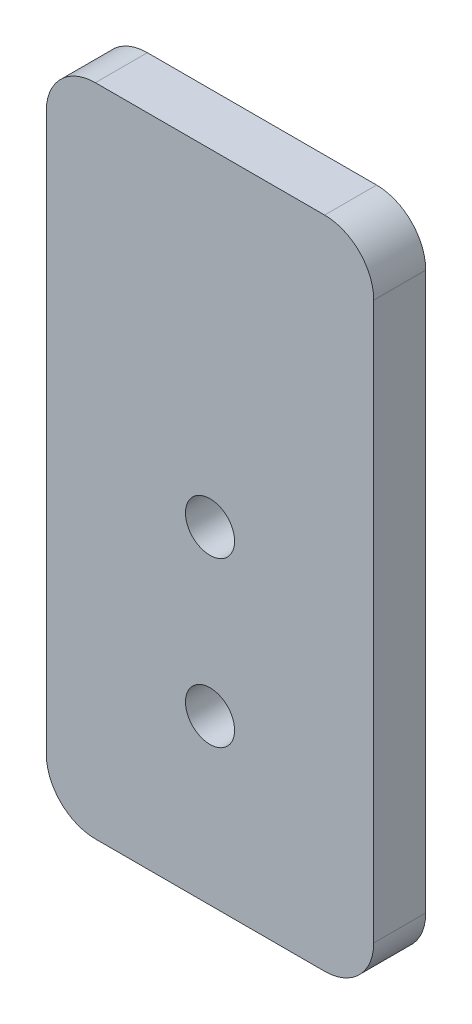
ISO-10303-21;
HEADER;
FILE_DESCRIPTION(('STEP AP214'),'2;1');
FILE_NAME('part.step','',(''),(''),'','','');
FILE_SCHEMA(('AUTOMOTIVE_DESIGN { 1 0 10303 214 1 1 1 1 }'));
ENDSEC;
DATA;
#1=APPLICATION_CONTEXT('core data for automotive mechanical design processes');
#2=APPLICATION_PROTOCOL_DEFINITION('international standard','automotive_design',2000,#1);
#3=PRODUCT_CONTEXT('',#1,'mechanical');
#4=PRODUCT('Part','Part','',(#3));
#5=PRODUCT_RELATED_PRODUCT_CATEGORY('part','',(#4));
#6=PRODUCT_DEFINITION_FORMATION('','',#4);
#7=PRODUCT_DEFINITION_CONTEXT('part definition',#1,'design');
#8=PRODUCT_DEFINITION('design','',#6,#7);
#9=PRODUCT_DEFINITION_SHAPE('','',#8);
#10=(LENGTH_UNIT() NAMED_UNIT(*) SI_UNIT(.MILLI.,.METRE.));
#11=(NAMED_UNIT(*) PLANE_ANGLE_UNIT() SI_UNIT($,.RADIAN.));
#12=(NAMED_UNIT(*) SI_UNIT($,.STERADIAN.) SOLID_ANGLE_UNIT());
#13=UNCERTAINTY_MEASURE_WITH_UNIT(LENGTH_MEASURE(1.E-05),#10,'distance_accuracy_value','');
#14=(GEOMETRIC_REPRESENTATION_CONTEXT(3) GLOBAL_UNCERTAINTY_ASSIGNED_CONTEXT((#13)) GLOBAL_UNIT_ASSIGNED_CONTEXT((#10,
#11,#12)) REPRESENTATION_CONTEXT('',''));
#15=CARTESIAN_POINT('',(0.,0.,0.));
#16=DIRECTION('',(0.,0.,1.));
#17=DIRECTION('',(1.,0.,0.));
#18=AXIS2_PLACEMENT_3D('',#15,#16,#17);
#19=CARTESIAN_POINT('',(0.,0.,3.175));
#20=DIRECTION('',(0.,0.,-1.));
#21=DIRECTION('',(-1.,0.,0.));
#22=AXIS2_PLACEMENT_3D('',#19,#20,#21);
#23=PLANE('',#22);
#24=DIRECTION('',(0.,-1.,0.));
#25=VECTOR('',#24,1.);
#26=CARTESIAN_POINT('',(-10.,-20.,3.175));
#27=LINE('',#26,#25);
#28=CARTESIAN_POINT('',(-10.,17.,3.175));
#29=VERTEX_POINT('',#28);
#30=CARTESIAN_POINT('',(-10.,-17.,3.175));
#31=VERTEX_POINT('',#30);
#32=EDGE_CURVE('E148',#29,#31,#27,.T.);
#33=ORIENTED_EDGE('',*,*,#32,.T.);
#34=CARTESIAN_POINT('',(-7.,-17.,3.175));
#35=DIRECTION('',(0.,0.,-1.));
#36=DIRECTION('',(-1.,0.,0.));
#37=AXIS2_PLACEMENT_3D('',#34,#35,#36);
#38=CIRCLE('',#37,3.);
#39=CARTESIAN_POINT('',(-7.,-20.,3.175));
#40=VERTEX_POINT('',#39);
#41=EDGE_CURVE('E131',#31,#40,#38,.F.);
#42=ORIENTED_EDGE('',*,*,#41,.T.);
#43=DIRECTION('',(1.,0.,0.));
#44=VECTOR('',#43,1.);
#45=CARTESIAN_POINT('',(-10.,-20.,3.175));
#46=LINE('',#45,#44);
#47=CARTESIAN_POINT('',(7.,-20.,3.175));
#48=VERTEX_POINT('',#47);
#49=EDGE_CURVE('E102',#40,#48,#46,.T.);
#50=ORIENTED_EDGE('',*,*,#49,.T.);
#51=CARTESIAN_POINT('',(7.,-17.,3.175));
#52=DIRECTION('',(0.,0.,-1.));
#53=DIRECTION('',(-1.,0.,0.));
#54=AXIS2_PLACEMENT_3D('',#51,#52,#53);
#55=CIRCLE('',#54,3.);
#56=CARTESIAN_POINT('',(10.,-17.,3.175));
#57=VERTEX_POINT('',#56);
#58=EDGE_CURVE('E129',#48,#57,#55,.F.);
#59=ORIENTED_EDGE('',*,*,#58,.T.);
#60=DIRECTION('',(0.,1.,0.));
#61=VECTOR('',#60,1.);
#62=CARTESIAN_POINT('',(10.,-20.,3.175));
#63=LINE('',#62,#61);
#64=CARTESIAN_POINT('',(10.,17.,3.175));
#65=VERTEX_POINT('',#64);
#66=EDGE_CURVE('E109',#57,#65,#63,.T.);
#67=ORIENTED_EDGE('',*,*,#66,.T.);
#68=CARTESIAN_POINT('',(7.,17.,3.175));
#69=DIRECTION('',(0.,0.,-1.));
#70=DIRECTION('',(-1.,0.,0.));
#71=AXIS2_PLACEMENT_3D('',#68,#69,#70);
#72=CIRCLE('',#71,3.);
#73=CARTESIAN_POINT('',(7.,20.,3.175));
#74=VERTEX_POINT('',#73);
#75=EDGE_CURVE('E37',#65,#74,#72,.F.);
#76=ORIENTED_EDGE('',*,*,#75,.T.);
#77=DIRECTION('',(-1.,0.,0.));
#78=VECTOR('',#77,1.);
#79=CARTESIAN_POINT('',(-10.,20.,3.175));
#80=LINE('',#79,#78);
#81=CARTESIAN_POINT('',(-7.,20.,3.175));
#82=VERTEX_POINT('',#81);
#83=EDGE_CURVE('E112',#74,#82,#80,.T.);
#84=ORIENTED_EDGE('',*,*,#83,.T.);
#85=CARTESIAN_POINT('',(-7.,17.,3.175));
#86=DIRECTION('',(0.,0.,-1.));
#87=DIRECTION('',(-1.,0.,0.));
#88=AXIS2_PLACEMENT_3D('',#85,#86,#87);
#89=CIRCLE('',#88,3.);
#90=EDGE_CURVE('E127',#82,#29,#89,.F.);
#91=ORIENTED_EDGE('',*,*,#90,.T.);
#92=EDGE_LOOP('',(#33,#42,#50,#59,#67,#76,#84,#91));
#93=FACE_BOUND('',#92,.T.);
#94=CARTESIAN_POINT('',(0.,0.,3.175));
#95=DIRECTION('',(0.,0.,1.));
#96=DIRECTION('',(1.,0.,0.));
#97=AXIS2_PLACEMENT_3D('',#94,#95,#96);
#98=CIRCLE('',#97,1.5);
#99=CARTESIAN_POINT('',(1.5,0.,3.175));
#100=VERTEX_POINT('',#99);
#101=EDGE_CURVE('E144',#100,#100,#98,.T.);
#102=ORIENTED_EDGE('',*,*,#101,.F.);
#103=EDGE_LOOP('',(#102));
#104=FACE_BOUND('',#103,.T.);
#105=CARTESIAN_POINT('',(0.,-10.,3.175));
#106=DIRECTION('',(0.,0.,1.));
#107=DIRECTION('',(1.,0.,0.));
#108=AXIS2_PLACEMENT_3D('',#105,#106,#107);
#109=CIRCLE('',#108,1.5);
#110=CARTESIAN_POINT('',(1.5,-10.,3.175));
#111=VERTEX_POINT('',#110);
#112=EDGE_CURVE('E155',#111,#111,#109,.T.);
#113=ORIENTED_EDGE('',*,*,#112,.F.);
#114=EDGE_LOOP('',(#113));
#115=FACE_BOUND('',#114,.T.);
#116=ADVANCED_FACE('F17',(#93,#104,#115),#23,.F.);
#117=CARTESIAN_POINT('',(0.,0.,0.));
#118=DIRECTION('',(0.,0.,-1.));
#119=DIRECTION('',(-1.,0.,0.));
#120=AXIS2_PLACEMENT_3D('',#117,#118,#119);
#121=PLANE('',#120);
#122=CARTESIAN_POINT('',(0.,0.,0.));
#123=DIRECTION('',(0.,0.,1.));
#124=DIRECTION('',(1.,0.,0.));
#125=AXIS2_PLACEMENT_3D('',#122,#123,#124);
#126=CIRCLE('',#125,1.5);
#127=CARTESIAN_POINT('',(1.5,0.,0.));
#128=VERTEX_POINT('',#127);
#129=EDGE_CURVE('E152',#128,#128,#126,.T.);
#130=ORIENTED_EDGE('',*,*,#129,.T.);
#131=EDGE_LOOP('',(#130));
#132=FACE_BOUND('',#131,.T.);
#133=DIRECTION('',(1.,0.,0.));
#134=VECTOR('',#133,1.);
#135=CARTESIAN_POINT('',(-10.,-20.,0.));
#136=LINE('',#135,#134);
#137=CARTESIAN_POINT('',(-7.,-20.,0.));
#138=VERTEX_POINT('',#137);
#139=CARTESIAN_POINT('',(7.,-20.,0.));
#140=VERTEX_POINT('',#139);
#141=EDGE_CURVE('E99',#138,#140,#136,.T.);
#142=ORIENTED_EDGE('',*,*,#141,.F.);
#143=CARTESIAN_POINT('',(-7.,-17.,0.));
#144=DIRECTION('',(0.,0.,-1.));
#145=DIRECTION('',(-1.,0.,0.));
#146=AXIS2_PLACEMENT_3D('',#143,#144,#145);
#147=CIRCLE('',#146,3.);
#148=CARTESIAN_POINT('',(-10.,-17.,0.));
#149=VERTEX_POINT('',#148);
#150=EDGE_CURVE('E82',#138,#149,#147,.T.);
#151=ORIENTED_EDGE('',*,*,#150,.T.);
#152=DIRECTION('',(0.,-1.,0.));
#153=VECTOR('',#152,1.);
#154=CARTESIAN_POINT('',(-10.,-20.,0.));
#155=LINE('',#154,#153);
#156=CARTESIAN_POINT('',(-10.,17.,0.));
#157=VERTEX_POINT('',#156);
#158=EDGE_CURVE('E110',#157,#149,#155,.T.);
#159=ORIENTED_EDGE('',*,*,#158,.F.);
#160=CARTESIAN_POINT('',(-7.,17.,0.));
#161=DIRECTION('',(0.,0.,-1.));
#162=DIRECTION('',(-1.,0.,0.));
#163=AXIS2_PLACEMENT_3D('',#160,#161,#162);
#164=CIRCLE('',#163,3.);
#165=CARTESIAN_POINT('',(-7.,20.,0.));
#166=VERTEX_POINT('',#165);
#167=EDGE_CURVE('E120',#157,#166,#164,.T.);
#168=ORIENTED_EDGE('',*,*,#167,.T.);
#169=DIRECTION('',(-1.,0.,0.));
#170=VECTOR('',#169,1.);
#171=CARTESIAN_POINT('',(-10.,20.,0.));
#172=LINE('',#171,#170);
#173=CARTESIAN_POINT('',(7.,20.,0.));
#174=VERTEX_POINT('',#173);
#175=EDGE_CURVE('E114',#174,#166,#172,.T.);
#176=ORIENTED_EDGE('',*,*,#175,.F.);
#177=CARTESIAN_POINT('',(7.,17.,0.));
#178=DIRECTION('',(0.,0.,-1.));
#179=DIRECTION('',(-1.,0.,0.));
#180=AXIS2_PLACEMENT_3D('',#177,#178,#179);
#181=CIRCLE('',#180,3.);
#182=CARTESIAN_POINT('',(10.,17.,0.));
#183=VERTEX_POINT('',#182);
#184=EDGE_CURVE('E103',#174,#183,#181,.T.);
#185=ORIENTED_EDGE('',*,*,#184,.T.);
#186=DIRECTION('',(0.,1.,0.));
#187=VECTOR('',#186,1.);
#188=CARTESIAN_POINT('',(10.,-20.,0.));
#189=LINE('',#188,#187);
#190=CARTESIAN_POINT('',(10.,-17.,0.));
#191=VERTEX_POINT('',#190);
#192=EDGE_CURVE('E143',#191,#183,#189,.T.);
#193=ORIENTED_EDGE('',*,*,#192,.F.);
#194=CARTESIAN_POINT('',(7.,-17.,0.));
#195=DIRECTION('',(0.,0.,-1.));
#196=DIRECTION('',(-1.,0.,0.));
#197=AXIS2_PLACEMENT_3D('',#194,#195,#196);
#198=CIRCLE('',#197,3.);
#199=EDGE_CURVE('E93',#191,#140,#198,.T.);
#200=ORIENTED_EDGE('',*,*,#199,.T.);
#201=EDGE_LOOP('',(#142,#151,#159,#168,#176,#185,#193,#200));
#202=FACE_BOUND('',#201,.T.);
#203=CARTESIAN_POINT('',(0.,-10.,0.));
#204=DIRECTION('',(0.,0.,1.));
#205=DIRECTION('',(1.,0.,0.));
#206=AXIS2_PLACEMENT_3D('',#203,#204,#205);
#207=CIRCLE('',#206,1.5);
#208=CARTESIAN_POINT('',(1.5,-10.,0.));
#209=VERTEX_POINT('',#208);
#210=EDGE_CURVE('E158',#209,#209,#207,.T.);
#211=ORIENTED_EDGE('',*,*,#210,.T.);
#212=EDGE_LOOP('',(#211));
#213=FACE_BOUND('',#212,.T.);
#214=ADVANCED_FACE('F106',(#132,#202,#213),#121,.T.);
#215=CARTESIAN_POINT('',(10.,-20.,3.175));
#216=DIRECTION('',(-1.,0.,0.));
#217=DIRECTION('',(0.,0.,1.));
#218=AXIS2_PLACEMENT_3D('',#215,#216,#217);
#219=PLANE('',#218);
#220=ORIENTED_EDGE('',*,*,#66,.F.);
#221=DIRECTION('',(0.,0.,-1.));
#222=VECTOR('',#221,1.);
#223=CARTESIAN_POINT('',(10.,-17.,3.175));
#224=LINE('',#223,#222);
#225=EDGE_CURVE('E135',#57,#191,#224,.T.);
#226=ORIENTED_EDGE('',*,*,#225,.T.);
#227=ORIENTED_EDGE('',*,*,#192,.T.);
#228=DIRECTION('',(0.,0.,-1.));
#229=VECTOR('',#228,1.);
#230=CARTESIAN_POINT('',(10.,17.,3.175));
#231=LINE('',#230,#229);
#232=EDGE_CURVE('E133',#183,#65,#231,.F.);
#233=ORIENTED_EDGE('',*,*,#232,.T.);
#234=EDGE_LOOP('',(#220,#226,#227,#233));
#235=FACE_BOUND('',#234,.T.);
#236=ADVANCED_FACE('F173',(#235),#219,.F.);
#237=CARTESIAN_POINT('',(-10.,20.,3.175));
#238=DIRECTION('',(0.,-1.,0.));
#239=DIRECTION('',(0.,0.,-1.));
#240=AXIS2_PLACEMENT_3D('',#237,#238,#239);
#241=PLANE('',#240);
#242=ORIENTED_EDGE('',*,*,#175,.T.);
#243=DIRECTION('',(0.,0.,-1.));
#244=VECTOR('',#243,1.);
#245=CARTESIAN_POINT('',(-7.,20.,3.175));
#246=LINE('',#245,#244);
#247=EDGE_CURVE('E11',#166,#82,#246,.F.);
#248=ORIENTED_EDGE('',*,*,#247,.T.);
#249=ORIENTED_EDGE('',*,*,#83,.F.);
#250=DIRECTION('',(0.,0.,-1.));
#251=VECTOR('',#250,1.);
#252=CARTESIAN_POINT('',(7.,20.,3.175));
#253=LINE('',#252,#251);
#254=EDGE_CURVE('E25',#74,#174,#253,.T.);
#255=ORIENTED_EDGE('',*,*,#254,.T.);
#256=EDGE_LOOP('',(#242,#248,#249,#255));
#257=FACE_BOUND('',#256,.T.);
#258=ADVANCED_FACE('F140',(#257),#241,.F.);
#259=CARTESIAN_POINT('',(-10.,-20.,3.175));
#260=DIRECTION('',(1.,0.,0.));
#261=DIRECTION('',(0.,0.,-1.));
#262=AXIS2_PLACEMENT_3D('',#259,#260,#261);
#263=PLANE('',#262);
#264=ORIENTED_EDGE('',*,*,#158,.T.);
#265=DIRECTION('',(0.,0.,-1.));
#266=VECTOR('',#265,1.);
#267=CARTESIAN_POINT('',(-10.,-17.,3.175));
#268=LINE('',#267,#266);
#269=EDGE_CURVE('E87',#149,#31,#268,.F.);
#270=ORIENTED_EDGE('',*,*,#269,.T.);
#271=ORIENTED_EDGE('',*,*,#32,.F.);
#272=DIRECTION('',(0.,0.,-1.));
#273=VECTOR('',#272,1.);
#274=CARTESIAN_POINT('',(-10.,17.,3.175));
#275=LINE('',#274,#273);
#276=EDGE_CURVE('E92',#29,#157,#275,.T.);
#277=ORIENTED_EDGE('',*,*,#276,.T.);
#278=EDGE_LOOP('',(#264,#270,#271,#277));
#279=FACE_BOUND('',#278,.T.);
#280=ADVANCED_FACE('F183',(#279),#263,.F.);
#281=CARTESIAN_POINT('',(-10.,-20.,3.175));
#282=DIRECTION('',(0.,1.,0.));
#283=DIRECTION('',(0.,0.,1.));
#284=AXIS2_PLACEMENT_3D('',#281,#282,#283);
#285=PLANE('',#284);
#286=ORIENTED_EDGE('',*,*,#49,.F.);
#287=DIRECTION('',(0.,0.,-1.));
#288=VECTOR('',#287,1.);
#289=CARTESIAN_POINT('',(-7.,-20.,3.175));
#290=LINE('',#289,#288);
#291=EDGE_CURVE('E86',#40,#138,#290,.T.);
#292=ORIENTED_EDGE('',*,*,#291,.T.);
#293=ORIENTED_EDGE('',*,*,#141,.T.);
#294=DIRECTION('',(0.,0.,-1.));
#295=VECTOR('',#294,1.);
#296=CARTESIAN_POINT('',(7.,-20.,3.175));
#297=LINE('',#296,#295);
#298=EDGE_CURVE('E104',#140,#48,#297,.F.);
#299=ORIENTED_EDGE('',*,*,#298,.T.);
#300=EDGE_LOOP('',(#286,#292,#293,#299));
#301=FACE_BOUND('',#300,.T.);
#302=ADVANCED_FACE('F98',(#301),#285,.F.);
#303=CARTESIAN_POINT('',(0.,0.,3.175));
#304=DIRECTION('',(0.,0.,-1.));
#305=DIRECTION('',(-1.,0.,0.));
#306=AXIS2_PLACEMENT_3D('',#303,#304,#305);
#307=CYLINDRICAL_SURFACE('',#306,1.5);
#308=ORIENTED_EDGE('',*,*,#101,.T.);
#309=EDGE_LOOP('',(#308));
#310=FACE_BOUND('',#309,.T.);
#311=ORIENTED_EDGE('',*,*,#129,.F.);
#312=EDGE_LOOP('',(#311));
#313=FACE_BOUND('',#312,.T.);
#314=ADVANCED_FACE('F178',(#310,#313),#307,.F.);
#315=CARTESIAN_POINT('',(0.,-10.,3.175));
#316=DIRECTION('',(0.,0.,-1.));
#317=DIRECTION('',(-1.,0.,0.));
#318=AXIS2_PLACEMENT_3D('',#315,#316,#317);
#319=CYLINDRICAL_SURFACE('',#318,1.5);
#320=ORIENTED_EDGE('',*,*,#112,.T.);
#321=EDGE_LOOP('',(#320));
#322=FACE_BOUND('',#321,.T.);
#323=ORIENTED_EDGE('',*,*,#210,.F.);
#324=EDGE_LOOP('',(#323));
#325=FACE_BOUND('',#324,.T.);
#326=ADVANCED_FACE('F164',(#322,#325),#319,.F.);
#327=CARTESIAN_POINT('',(-7.,-17.,3.175));
#328=DIRECTION('',(0.,0.,-1.));
#329=DIRECTION('',(-1.,0.,0.));
#330=AXIS2_PLACEMENT_3D('',#327,#328,#329);
#331=CYLINDRICAL_SURFACE('',#330,3.);
#332=ORIENTED_EDGE('',*,*,#41,.F.);
#333=ORIENTED_EDGE('',*,*,#269,.F.);
#334=ORIENTED_EDGE('',*,*,#150,.F.);
#335=ORIENTED_EDGE('',*,*,#291,.F.);
#336=EDGE_LOOP('',(#332,#333,#334,#335));
#337=FACE_BOUND('',#336,.T.);
#338=ADVANCED_FACE('F85',(#337),#331,.T.);
#339=CARTESIAN_POINT('',(7.,-17.,3.175));
#340=DIRECTION('',(0.,0.,-1.));
#341=DIRECTION('',(-1.,0.,0.));
#342=AXIS2_PLACEMENT_3D('',#339,#340,#341);
#343=CYLINDRICAL_SURFACE('',#342,3.);
#344=ORIENTED_EDGE('',*,*,#58,.F.);
#345=ORIENTED_EDGE('',*,*,#298,.F.);
#346=ORIENTED_EDGE('',*,*,#199,.F.);
#347=ORIENTED_EDGE('',*,*,#225,.F.);
#348=EDGE_LOOP('',(#344,#345,#346,#347));
#349=FACE_BOUND('',#348,.T.);
#350=ADVANCED_FACE('F194',(#349),#343,.T.);
#351=CARTESIAN_POINT('',(-7.,17.,3.175));
#352=DIRECTION('',(0.,0.,-1.));
#353=DIRECTION('',(-1.,0.,0.));
#354=AXIS2_PLACEMENT_3D('',#351,#352,#353);
#355=CYLINDRICAL_SURFACE('',#354,3.);
#356=ORIENTED_EDGE('',*,*,#90,.F.);
#357=ORIENTED_EDGE('',*,*,#247,.F.);
#358=ORIENTED_EDGE('',*,*,#167,.F.);
#359=ORIENTED_EDGE('',*,*,#276,.F.);
#360=EDGE_LOOP('',(#356,#357,#358,#359));
#361=FACE_BOUND('',#360,.T.);
#362=ADVANCED_FACE('F196',(#361),#355,.T.);
#363=CARTESIAN_POINT('',(7.,17.,3.175));
#364=DIRECTION('',(0.,0.,-1.));
#365=DIRECTION('',(-1.,0.,0.));
#366=AXIS2_PLACEMENT_3D('',#363,#364,#365);
#367=CYLINDRICAL_SURFACE('',#366,3.);
#368=ORIENTED_EDGE('',*,*,#75,.F.);
#369=ORIENTED_EDGE('',*,*,#232,.F.);
#370=ORIENTED_EDGE('',*,*,#184,.F.);
#371=ORIENTED_EDGE('',*,*,#254,.F.);
#372=EDGE_LOOP('',(#368,#369,#370,#371));
#373=FACE_BOUND('',#372,.T.);
#374=ADVANCED_FACE('F19',(#373),#367,.T.);
#375=CLOSED_SHELL('',(#116,#214,#236,#258,#280,#302,#314,#326,#338,#350,#362,#374));
#376=MANIFOLD_SOLID_BREP('B1',#375);
#377=ADVANCED_BREP_SHAPE_REPRESENTATION('',(#18,#376),#14);
#378=SHAPE_DEFINITION_REPRESENTATION(#9,#377);
ENDSEC;
END-ISO-10303-21;
